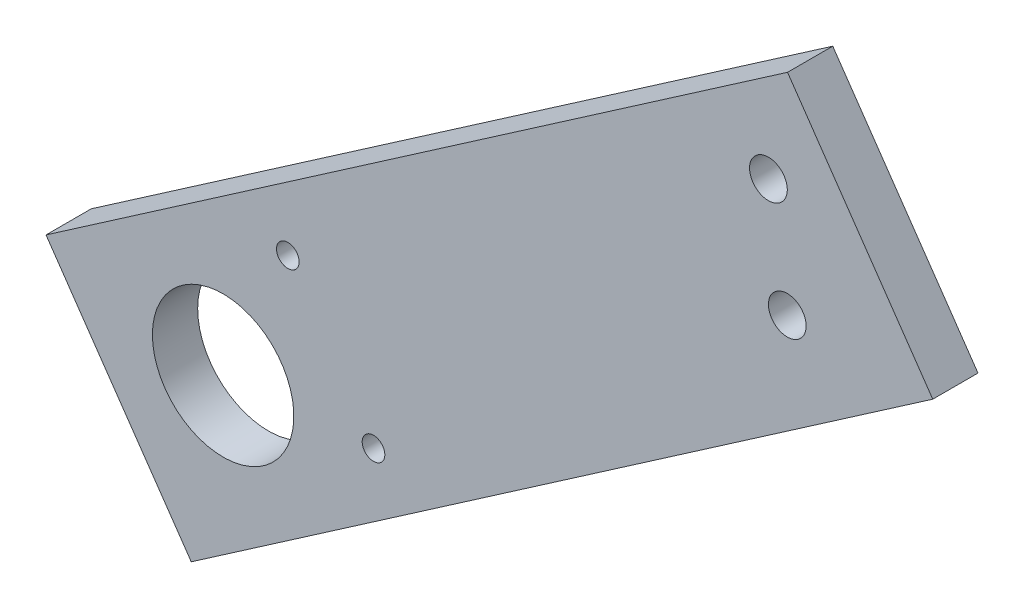
ISO-10303-21;
HEADER;
FILE_DESCRIPTION(('STEP AP214'),'2;1');
FILE_NAME('part.step','',(''),(''),'','','');
FILE_SCHEMA(('AUTOMOTIVE_DESIGN { 1 0 10303 214 1 1 1 1 }'));
ENDSEC;
DATA;
#1=APPLICATION_CONTEXT('core data for automotive mechanical design processes');
#2=APPLICATION_PROTOCOL_DEFINITION('international standard','automotive_design',2000,#1);
#3=PRODUCT_CONTEXT('',#1,'mechanical');
#4=PRODUCT('Part','Part','',(#3));
#5=PRODUCT_RELATED_PRODUCT_CATEGORY('part','',(#4));
#6=PRODUCT_DEFINITION_FORMATION('','',#4);
#7=PRODUCT_DEFINITION_CONTEXT('part definition',#1,'design');
#8=PRODUCT_DEFINITION('design','',#6,#7);
#9=PRODUCT_DEFINITION_SHAPE('','',#8);
#10=(LENGTH_UNIT() NAMED_UNIT(*) SI_UNIT(.MILLI.,.METRE.));
#11=(NAMED_UNIT(*) PLANE_ANGLE_UNIT() SI_UNIT($,.RADIAN.));
#12=(NAMED_UNIT(*) SI_UNIT($,.STERADIAN.) SOLID_ANGLE_UNIT());
#13=UNCERTAINTY_MEASURE_WITH_UNIT(LENGTH_MEASURE(1.E-05),#10,'distance_accuracy_value','');
#14=(GEOMETRIC_REPRESENTATION_CONTEXT(3) GLOBAL_UNCERTAINTY_ASSIGNED_CONTEXT((#13)) GLOBAL_UNIT_ASSIGNED_CONTEXT((#10,
#11,#12)) REPRESENTATION_CONTEXT('',''));
#15=CARTESIAN_POINT('',(0.,0.,0.));
#16=DIRECTION('',(0.,0.,1.));
#17=DIRECTION('',(1.,0.,0.));
#18=AXIS2_PLACEMENT_3D('',#15,#16,#17);
#19=CARTESIAN_POINT('',(503.023620212534,108.421442016098,3.048));
#20=DIRECTION('',(0.,0.,1.));
#21=DIRECTION('',(1.,0.,0.));
#22=AXIS2_PLACEMENT_3D('',#19,#20,#21);
#23=PLANE('',#22);
#24=CARTESIAN_POINT('',(519.308599462827,115.367159157938,3.048));
#25=DIRECTION('',(0.,0.,1.));
#26=DIRECTION('',(1.,0.,0.));
#27=AXIS2_PLACEMENT_3D('',#24,#25,#26);
#28=CIRCLE('',#27,0.762000000000086);
#29=CARTESIAN_POINT('',(518.546599462827,115.367159157938,3.048));
#30=VERTEX_POINT('',#29);
#31=EDGE_CURVE('E124',#30,#30,#28,.T.);
#32=ORIENTED_EDGE('',*,*,#31,.F.);
#33=EDGE_LOOP('',(#32));
#34=FACE_BOUND('',#33,.T.);
#35=CARTESIAN_POINT('',(552.942296833607,128.696327154486,3.048));
#36=DIRECTION('',(0.,0.,1.));
#37=DIRECTION('',(1.,0.,0.));
#38=AXIS2_PLACEMENT_3D('',#35,#36,#37);
#39=CIRCLE('',#38,1.27000000000003);
#40=CARTESIAN_POINT('',(551.672296833607,128.696327154486,3.048));
#41=VERTEX_POINT('',#40);
#42=EDGE_CURVE('E112',#41,#41,#39,.T.);
#43=ORIENTED_EDGE('',*,*,#42,.F.);
#44=EDGE_LOOP('',(#43));
#45=FACE_BOUND('',#44,.T.);
#46=DIRECTION('',(-0.823109940869233,-0.567882052227616,0.));
#47=VECTOR('',#46,1.);
#48=CARTESIAN_POINT('',(552.957131223889,142.871693799126,3.048));
#49=LINE('',#48,#47);
#50=CARTESIAN_POINT('',(552.957131223889,142.871693799126,3.048));
#51=VERTEX_POINT('',#50);
#52=CARTESIAN_POINT('',(503.023620212534,108.421442016098,3.048));
#53=VERTEX_POINT('',#52);
#54=EDGE_CURVE('E82',#51,#53,#49,.T.);
#55=ORIENTED_EDGE('',*,*,#54,.T.);
#56=DIRECTION('',(0.567882052227616,-0.823109940869232,0.));
#57=VECTOR('',#56,1.);
#58=CARTESIAN_POINT('',(503.023620212534,108.421442016098,3.048));
#59=LINE('',#58,#57);
#60=CARTESIAN_POINT('',(512.803524331704,94.2460753714576,3.048));
#61=VERTEX_POINT('',#60);
#62=EDGE_CURVE('E77',#53,#61,#59,.T.);
#63=ORIENTED_EDGE('',*,*,#62,.T.);
#64=DIRECTION('',(0.823109940869232,0.567882052227616,0.));
#65=VECTOR('',#64,1.);
#66=CARTESIAN_POINT('',(562.737035343059,128.696327154486,3.048));
#67=LINE('',#66,#65);
#68=CARTESIAN_POINT('',(562.737035343059,128.696327154486,3.048));
#69=VERTEX_POINT('',#68);
#70=EDGE_CURVE('E80',#61,#69,#67,.T.);
#71=ORIENTED_EDGE('',*,*,#70,.T.);
#72=DIRECTION('',(-0.567882052227616,0.823109940869232,0.));
#73=VECTOR('',#72,1.);
#74=CARTESIAN_POINT('',(552.957131223889,142.871693799126,3.048));
#75=LINE('',#74,#73);
#76=EDGE_CURVE('E47',#69,#51,#75,.T.);
#77=ORIENTED_EDGE('',*,*,#76,.T.);
#78=EDGE_LOOP('',(#55,#63,#71,#77));
#79=FACE_BOUND('',#78,.T.);
#80=CARTESIAN_POINT('',(551.672296833607,136.012198904165,3.048));
#81=DIRECTION('',(0.,0.,1.));
#82=DIRECTION('',(1.,0.,0.));
#83=AXIS2_PLACEMENT_3D('',#80,#81,#82);
#84=CIRCLE('',#83,1.27000000000003);
#85=CARTESIAN_POINT('',(550.402296833607,136.012198904165,3.048));
#86=VERTEX_POINT('',#85);
#87=EDGE_CURVE('E97',#86,#86,#84,.T.);
#88=ORIENTED_EDGE('',*,*,#87,.F.);
#89=EDGE_LOOP('',(#88));
#90=FACE_BOUND('',#89,.T.);
#91=CARTESIAN_POINT('',(514.951045640116,106.189069777125,3.048));
#92=DIRECTION('',(0.,0.,1.));
#93=DIRECTION('',(1.,0.,0.));
#94=AXIS2_PLACEMENT_3D('',#91,#92,#93);
#95=CIRCLE('',#94,4.76250000000001);
#96=CARTESIAN_POINT('',(510.188545640116,106.189069777125,3.048));
#97=VERTEX_POINT('',#96);
#98=EDGE_CURVE('E118',#97,#97,#95,.T.);
#99=ORIENTED_EDGE('',*,*,#98,.F.);
#100=EDGE_LOOP('',(#99));
#101=FACE_BOUND('',#100,.T.);
#102=CARTESIAN_POINT('',(525.078281113459,107.004362158706,3.048));
#103=DIRECTION('',(0.,0.,1.));
#104=DIRECTION('',(1.,0.,0.));
#105=AXIS2_PLACEMENT_3D('',#102,#103,#104);
#106=CIRCLE('',#105,0.761999999999976);
#107=CARTESIAN_POINT('',(524.316281113459,107.004362158706,3.048));
#108=VERTEX_POINT('',#107);
#109=EDGE_CURVE('E130',#108,#108,#106,.T.);
#110=ORIENTED_EDGE('',*,*,#109,.F.);
#111=EDGE_LOOP('',(#110));
#112=FACE_BOUND('',#111,.T.);
#113=ADVANCED_FACE('F30',(#34,#45,#79,#90,#101,#112),#23,.T.);
#114=CARTESIAN_POINT('',(503.023620212534,108.421442016098,0.));
#115=DIRECTION('',(0.,0.,1.));
#116=DIRECTION('',(1.,0.,0.));
#117=AXIS2_PLACEMENT_3D('',#114,#115,#116);
#118=PLANE('',#117);
#119=CARTESIAN_POINT('',(519.308599462827,115.367159157938,0.));
#120=DIRECTION('',(0.,0.,1.));
#121=DIRECTION('',(1.,0.,0.));
#122=AXIS2_PLACEMENT_3D('',#119,#120,#121);
#123=CIRCLE('',#122,0.762000000000086);
#124=CARTESIAN_POINT('',(518.546599462827,115.367159157938,0.));
#125=VERTEX_POINT('',#124);
#126=EDGE_CURVE('E127',#125,#125,#123,.T.);
#127=ORIENTED_EDGE('',*,*,#126,.T.);
#128=EDGE_LOOP('',(#127));
#129=FACE_BOUND('',#128,.T.);
#130=CARTESIAN_POINT('',(552.942296833607,128.696327154486,0.));
#131=DIRECTION('',(0.,0.,1.));
#132=DIRECTION('',(1.,0.,0.));
#133=AXIS2_PLACEMENT_3D('',#130,#131,#132);
#134=CIRCLE('',#133,1.27000000000003);
#135=CARTESIAN_POINT('',(551.672296833607,128.696327154486,0.));
#136=VERTEX_POINT('',#135);
#137=EDGE_CURVE('E115',#136,#136,#134,.T.);
#138=ORIENTED_EDGE('',*,*,#137,.T.);
#139=EDGE_LOOP('',(#138));
#140=FACE_BOUND('',#139,.T.);
#141=DIRECTION('',(-0.823109940869233,-0.567882052227616,0.));
#142=VECTOR('',#141,1.);
#143=CARTESIAN_POINT('',(552.957131223889,142.871693799126,0.));
#144=LINE('',#143,#142);
#145=CARTESIAN_POINT('',(552.957131223889,142.871693799126,0.));
#146=VERTEX_POINT('',#145);
#147=CARTESIAN_POINT('',(503.023620212534,108.421442016098,0.));
#148=VERTEX_POINT('',#147);
#149=EDGE_CURVE('E94',#146,#148,#144,.T.);
#150=ORIENTED_EDGE('',*,*,#149,.F.);
#151=DIRECTION('',(-0.567882052227616,0.823109940869232,0.));
#152=VECTOR('',#151,1.);
#153=CARTESIAN_POINT('',(552.957131223889,142.871693799126,0.));
#154=LINE('',#153,#152);
#155=CARTESIAN_POINT('',(562.737035343059,128.696327154486,0.));
#156=VERTEX_POINT('',#155);
#157=EDGE_CURVE('E70',#156,#146,#154,.T.);
#158=ORIENTED_EDGE('',*,*,#157,.F.);
#159=DIRECTION('',(0.823109940869232,0.567882052227616,0.));
#160=VECTOR('',#159,1.);
#161=CARTESIAN_POINT('',(562.737035343059,128.696327154486,0.));
#162=LINE('',#161,#160);
#163=CARTESIAN_POINT('',(512.803524331704,94.2460753714576,0.));
#164=VERTEX_POINT('',#163);
#165=EDGE_CURVE('E64',#164,#156,#162,.T.);
#166=ORIENTED_EDGE('',*,*,#165,.F.);
#167=DIRECTION('',(0.567882052227616,-0.823109940869232,0.));
#168=VECTOR('',#167,1.);
#169=CARTESIAN_POINT('',(503.023620212534,108.421442016098,0.));
#170=LINE('',#169,#168);
#171=EDGE_CURVE('E86',#148,#164,#170,.T.);
#172=ORIENTED_EDGE('',*,*,#171,.F.);
#173=EDGE_LOOP('',(#150,#158,#166,#172));
#174=FACE_BOUND('',#173,.T.);
#175=CARTESIAN_POINT('',(551.672296833607,136.012198904165,0.));
#176=DIRECTION('',(0.,0.,1.));
#177=DIRECTION('',(1.,0.,0.));
#178=AXIS2_PLACEMENT_3D('',#175,#176,#177);
#179=CIRCLE('',#178,1.27000000000003);
#180=CARTESIAN_POINT('',(550.402296833607,136.012198904165,0.));
#181=VERTEX_POINT('',#180);
#182=EDGE_CURVE('E109',#181,#181,#179,.T.);
#183=ORIENTED_EDGE('',*,*,#182,.T.);
#184=EDGE_LOOP('',(#183));
#185=FACE_BOUND('',#184,.T.);
#186=CARTESIAN_POINT('',(514.951045640116,106.189069777125,0.));
#187=DIRECTION('',(0.,0.,1.));
#188=DIRECTION('',(1.,0.,0.));
#189=AXIS2_PLACEMENT_3D('',#186,#187,#188);
#190=CIRCLE('',#189,4.76250000000001);
#191=CARTESIAN_POINT('',(510.188545640116,106.189069777125,0.));
#192=VERTEX_POINT('',#191);
#193=EDGE_CURVE('E121',#192,#192,#190,.T.);
#194=ORIENTED_EDGE('',*,*,#193,.T.);
#195=EDGE_LOOP('',(#194));
#196=FACE_BOUND('',#195,.T.);
#197=CARTESIAN_POINT('',(525.078281113459,107.004362158706,0.));
#198=DIRECTION('',(0.,0.,1.));
#199=DIRECTION('',(1.,0.,0.));
#200=AXIS2_PLACEMENT_3D('',#197,#198,#199);
#201=CIRCLE('',#200,0.761999999999976);
#202=CARTESIAN_POINT('',(524.316281113459,107.004362158706,0.));
#203=VERTEX_POINT('',#202);
#204=EDGE_CURVE('E133',#203,#203,#201,.T.);
#205=ORIENTED_EDGE('',*,*,#204,.T.);
#206=EDGE_LOOP('',(#205));
#207=FACE_BOUND('',#206,.T.);
#208=ADVANCED_FACE('F105',(#129,#140,#174,#185,#196,#207),#118,.F.);
#209=CARTESIAN_POINT('',(552.957131223889,142.871693799126,3.048));
#210=DIRECTION('',(0.567882052227616,-0.823109940869233,0.));
#211=DIRECTION('',(0.823109940869233,0.567882052227616,0.));
#212=AXIS2_PLACEMENT_3D('',#209,#210,#211);
#213=PLANE('',#212);
#214=ORIENTED_EDGE('',*,*,#149,.T.);
#215=DIRECTION('',(0.,0.,-1.));
#216=VECTOR('',#215,1.);
#217=CARTESIAN_POINT('',(503.023620212534,108.421442016098,3.048));
#218=LINE('',#217,#216);
#219=EDGE_CURVE('E11',#53,#148,#218,.T.);
#220=ORIENTED_EDGE('',*,*,#219,.F.);
#221=ORIENTED_EDGE('',*,*,#54,.F.);
#222=DIRECTION('',(0.,0.,-1.));
#223=VECTOR('',#222,1.);
#224=CARTESIAN_POINT('',(552.957131223889,142.871693799126,3.048));
#225=LINE('',#224,#223);
#226=EDGE_CURVE('E90',#51,#146,#225,.T.);
#227=ORIENTED_EDGE('',*,*,#226,.T.);
#228=EDGE_LOOP('',(#214,#220,#221,#227));
#229=FACE_BOUND('',#228,.T.);
#230=ADVANCED_FACE('F32',(#229),#213,.F.);
#231=CARTESIAN_POINT('',(503.023620212534,108.421442016098,3.048));
#232=DIRECTION('',(0.823109940869233,0.567882052227616,0.));
#233=DIRECTION('',(-0.567882052227616,0.823109940869233,0.));
#234=AXIS2_PLACEMENT_3D('',#231,#232,#233);
#235=PLANE('',#234);
#236=ORIENTED_EDGE('',*,*,#171,.T.);
#237=DIRECTION('',(0.,0.,-1.));
#238=VECTOR('',#237,1.);
#239=CARTESIAN_POINT('',(512.803524331704,94.2460753714576,3.048));
#240=LINE('',#239,#238);
#241=EDGE_CURVE('E39',#61,#164,#240,.T.);
#242=ORIENTED_EDGE('',*,*,#241,.F.);
#243=ORIENTED_EDGE('',*,*,#62,.F.);
#244=ORIENTED_EDGE('',*,*,#219,.T.);
#245=EDGE_LOOP('',(#236,#242,#243,#244));
#246=FACE_BOUND('',#245,.T.);
#247=ADVANCED_FACE('F85',(#246),#235,.F.);
#248=CARTESIAN_POINT('',(562.737035343059,128.696327154486,3.048));
#249=DIRECTION('',(-0.567882052227616,0.823109940869233,0.));
#250=DIRECTION('',(-0.823109940869233,-0.567882052227616,0.));
#251=AXIS2_PLACEMENT_3D('',#248,#249,#250);
#252=PLANE('',#251);
#253=ORIENTED_EDGE('',*,*,#165,.T.);
#254=DIRECTION('',(0.,0.,-1.));
#255=VECTOR('',#254,1.);
#256=CARTESIAN_POINT('',(562.737035343059,128.696327154486,3.048));
#257=LINE('',#256,#255);
#258=EDGE_CURVE('E87',#69,#156,#257,.T.);
#259=ORIENTED_EDGE('',*,*,#258,.F.);
#260=ORIENTED_EDGE('',*,*,#70,.F.);
#261=ORIENTED_EDGE('',*,*,#241,.T.);
#262=EDGE_LOOP('',(#253,#259,#260,#261));
#263=FACE_BOUND('',#262,.T.);
#264=ADVANCED_FACE('F88',(#263),#252,.F.);
#265=CARTESIAN_POINT('',(552.957131223889,142.871693799126,3.048));
#266=DIRECTION('',(-0.823109940869232,-0.567882052227616,0.));
#267=DIRECTION('',(0.567882052227616,-0.823109940869232,0.));
#268=AXIS2_PLACEMENT_3D('',#265,#266,#267);
#269=PLANE('',#268);
#270=ORIENTED_EDGE('',*,*,#157,.T.);
#271=ORIENTED_EDGE('',*,*,#226,.F.);
#272=ORIENTED_EDGE('',*,*,#76,.F.);
#273=ORIENTED_EDGE('',*,*,#258,.T.);
#274=EDGE_LOOP('',(#270,#271,#272,#273));
#275=FACE_BOUND('',#274,.T.);
#276=ADVANCED_FACE('F102',(#275),#269,.F.);
#277=CARTESIAN_POINT('',(551.672296833607,136.012198904165,3.048));
#278=DIRECTION('',(0.,0.,-1.));
#279=DIRECTION('',(-1.,0.,0.));
#280=AXIS2_PLACEMENT_3D('',#277,#278,#279);
#281=CYLINDRICAL_SURFACE('',#280,1.27000000000003);
#282=CARTESIAN_POINT('',(550.402296833607,136.012198904165,3.048));
#283=CARTESIAN_POINT('',(550.402296833607,136.012198904165,3.01625));
#284=CARTESIAN_POINT('',(550.402296833607,136.012198904165,2.9845));
#285=CARTESIAN_POINT('',(550.402296833607,136.012198904165,2.921));
#286=CARTESIAN_POINT('',(550.402296833607,136.012198904165,2.88925));
#287=CARTESIAN_POINT('',(550.402296833607,136.012198904165,2.82575));
#288=CARTESIAN_POINT('',(550.402296833607,136.012198904165,2.794));
#289=CARTESIAN_POINT('',(550.402296833607,136.012198904165,2.7305));
#290=CARTESIAN_POINT('',(550.402296833607,136.012198904165,2.69875));
#291=CARTESIAN_POINT('',(550.402296833607,136.012198904165,2.63525));
#292=CARTESIAN_POINT('',(550.402296833607,136.012198904165,2.6035));
#293=CARTESIAN_POINT('',(550.402296833607,136.012198904165,2.54));
#294=CARTESIAN_POINT('',(550.402296833607,136.012198904165,2.50825));
#295=CARTESIAN_POINT('',(550.402296833607,136.012198904165,2.44475));
#296=CARTESIAN_POINT('',(550.402296833607,136.012198904165,2.413));
#297=CARTESIAN_POINT('',(550.402296833607,136.012198904165,2.3495));
#298=CARTESIAN_POINT('',(550.402296833607,136.012198904165,2.31775));
#299=CARTESIAN_POINT('',(550.402296833607,136.012198904165,2.25425));
#300=CARTESIAN_POINT('',(550.402296833607,136.012198904165,2.2225));
#301=CARTESIAN_POINT('',(550.402296833607,136.012198904165,2.159));
#302=CARTESIAN_POINT('',(550.402296833607,136.012198904165,2.12725));
#303=CARTESIAN_POINT('',(550.402296833607,136.012198904165,2.06375));
#304=CARTESIAN_POINT('',(550.402296833607,136.012198904165,2.032));
#305=CARTESIAN_POINT('',(550.402296833607,136.012198904165,1.9685));
#306=CARTESIAN_POINT('',(550.402296833607,136.012198904165,1.93675));
#307=CARTESIAN_POINT('',(550.402296833607,136.012198904165,1.87325));
#308=CARTESIAN_POINT('',(550.402296833607,136.012198904165,1.8415));
#309=CARTESIAN_POINT('',(550.402296833607,136.012198904165,1.778));
#310=CARTESIAN_POINT('',(550.402296833607,136.012198904165,1.74625));
#311=CARTESIAN_POINT('',(550.402296833607,136.012198904165,1.68275));
#312=CARTESIAN_POINT('',(550.402296833607,136.012198904165,1.651));
#313=CARTESIAN_POINT('',(550.402296833607,136.012198904165,1.5875));
#314=CARTESIAN_POINT('',(550.402296833607,136.012198904165,1.55575));
#315=CARTESIAN_POINT('',(550.402296833607,136.012198904165,1.49225));
#316=CARTESIAN_POINT('',(550.402296833607,136.012198904165,1.4605));
#317=CARTESIAN_POINT('',(550.402296833607,136.012198904165,1.397));
#318=CARTESIAN_POINT('',(550.402296833607,136.012198904165,1.36525));
#319=CARTESIAN_POINT('',(550.402296833607,136.012198904165,1.30175));
#320=CARTESIAN_POINT('',(550.402296833607,136.012198904165,1.27));
#321=CARTESIAN_POINT('',(550.402296833607,136.012198904165,1.2065));
#322=CARTESIAN_POINT('',(550.402296833607,136.012198904165,1.17475));
#323=CARTESIAN_POINT('',(550.402296833607,136.012198904165,1.11125));
#324=CARTESIAN_POINT('',(550.402296833607,136.012198904165,1.0795));
#325=CARTESIAN_POINT('',(550.402296833607,136.012198904165,1.016));
#326=CARTESIAN_POINT('',(550.402296833607,136.012198904165,0.98425));
#327=CARTESIAN_POINT('',(550.402296833607,136.012198904165,0.92075));
#328=CARTESIAN_POINT('',(550.402296833607,136.012198904165,0.889));
#329=CARTESIAN_POINT('',(550.402296833607,136.012198904165,0.8255));
#330=CARTESIAN_POINT('',(550.402296833607,136.012198904165,0.79375));
#331=CARTESIAN_POINT('',(550.402296833607,136.012198904165,0.73025));
#332=CARTESIAN_POINT('',(550.402296833607,136.012198904165,0.6985));
#333=CARTESIAN_POINT('',(550.402296833607,136.012198904165,0.635));
#334=CARTESIAN_POINT('',(550.402296833607,136.012198904165,0.60325));
#335=CARTESIAN_POINT('',(550.402296833607,136.012198904165,0.53975));
#336=CARTESIAN_POINT('',(550.402296833607,136.012198904165,0.508));
#337=CARTESIAN_POINT('',(550.402296833607,136.012198904165,0.4445));
#338=CARTESIAN_POINT('',(550.402296833607,136.012198904165,0.41275));
#339=CARTESIAN_POINT('',(550.402296833607,136.012198904165,0.34925));
#340=CARTESIAN_POINT('',(550.402296833607,136.012198904165,0.3175));
#341=CARTESIAN_POINT('',(550.402296833607,136.012198904165,0.254));
#342=CARTESIAN_POINT('',(550.402296833607,136.012198904165,0.22225));
#343=CARTESIAN_POINT('',(550.402296833607,136.012198904165,0.15875));
#344=CARTESIAN_POINT('',(550.402296833607,136.012198904165,0.127));
#345=CARTESIAN_POINT('',(550.402296833607,136.012198904165,0.0634999999999999));
#346=CARTESIAN_POINT('',(550.402296833607,136.012198904165,0.03175));
#347=CARTESIAN_POINT('',(550.402296833607,136.012198904165,0.));
#348=B_SPLINE_CURVE_WITH_KNOTS('',3,(#282,#283,#284,#285,#286,#287,#288,#289,#290,#291,#292,
#293,#294,#295,#296,#297,#298,#299,#300,#301,#302,#303,#304,#305,#306,#307,#308,#309,#310,#311,
#312,#313,#314,#315,#316,#317,#318,#319,#320,#321,#322,#323,#324,#325,#326,#327,#328,#329,#330,
#331,#332,#333,#334,#335,#336,#337,#338,#339,#340,#341,#342,#343,#344,#345,#346,#347),
.UNSPECIFIED.,.F.,.F.,(4,2,2,2,2,2,2,2,2,2,2,2,2,2,2,2,2,2,2,2,2,2,2,2,2,2,2,2,2,2,2,2,4),(0.,
0.0952499999999998,0.1905,0.28575,0.381,0.47625,0.5715,0.66675,0.762,0.85725,0.9525,1.04775,
1.143,1.23825,1.3335,1.42875,1.524,1.61925,1.7145,1.80975,1.905,2.00025,2.0955,2.19075,2.286,
2.38125,2.4765,2.57175,2.667,2.76225,2.8575,2.95275,3.048),.UNSPECIFIED.);
#349=EDGE_CURVE('BSEAM153',#86,#181,#348,.T.);
#350=ORIENTED_EDGE('',*,*,#87,.T.);
#351=ORIENTED_EDGE('',*,*,#182,.F.);
#352=ORIENTED_EDGE('',*,*,#349,.T.);
#353=ORIENTED_EDGE('',*,*,#349,.F.);
#354=EDGE_LOOP('',(#350,#352,#351,#353));
#355=FACE_BOUND('',#354,.T.);
#356=ADVANCED_FACE('F153',(#355),#281,.F.);
#357=CARTESIAN_POINT('',(552.942296833607,128.696327154486,3.048));
#358=DIRECTION('',(0.,0.,-1.));
#359=DIRECTION('',(-1.,0.,0.));
#360=AXIS2_PLACEMENT_3D('',#357,#358,#359);
#361=CYLINDRICAL_SURFACE('',#360,1.27000000000003);
#362=CARTESIAN_POINT('',(551.672296833607,128.696327154486,3.048));
#363=CARTESIAN_POINT('',(551.672296833607,128.696327154486,3.01625));
#364=CARTESIAN_POINT('',(551.672296833607,128.696327154486,2.9845));
#365=CARTESIAN_POINT('',(551.672296833607,128.696327154486,2.921));
#366=CARTESIAN_POINT('',(551.672296833607,128.696327154486,2.88925));
#367=CARTESIAN_POINT('',(551.672296833607,128.696327154486,2.82575));
#368=CARTESIAN_POINT('',(551.672296833607,128.696327154486,2.794));
#369=CARTESIAN_POINT('',(551.672296833607,128.696327154486,2.7305));
#370=CARTESIAN_POINT('',(551.672296833607,128.696327154486,2.69875));
#371=CARTESIAN_POINT('',(551.672296833607,128.696327154486,2.63525));
#372=CARTESIAN_POINT('',(551.672296833607,128.696327154486,2.6035));
#373=CARTESIAN_POINT('',(551.672296833607,128.696327154486,2.54));
#374=CARTESIAN_POINT('',(551.672296833607,128.696327154486,2.50825));
#375=CARTESIAN_POINT('',(551.672296833607,128.696327154486,2.44475));
#376=CARTESIAN_POINT('',(551.672296833607,128.696327154486,2.413));
#377=CARTESIAN_POINT('',(551.672296833607,128.696327154486,2.3495));
#378=CARTESIAN_POINT('',(551.672296833607,128.696327154486,2.31775));
#379=CARTESIAN_POINT('',(551.672296833607,128.696327154486,2.25425));
#380=CARTESIAN_POINT('',(551.672296833607,128.696327154486,2.2225));
#381=CARTESIAN_POINT('',(551.672296833607,128.696327154486,2.159));
#382=CARTESIAN_POINT('',(551.672296833607,128.696327154486,2.12725));
#383=CARTESIAN_POINT('',(551.672296833607,128.696327154486,2.06375));
#384=CARTESIAN_POINT('',(551.672296833607,128.696327154486,2.032));
#385=CARTESIAN_POINT('',(551.672296833607,128.696327154486,1.9685));
#386=CARTESIAN_POINT('',(551.672296833607,128.696327154486,1.93675));
#387=CARTESIAN_POINT('',(551.672296833607,128.696327154486,1.87325));
#388=CARTESIAN_POINT('',(551.672296833607,128.696327154486,1.8415));
#389=CARTESIAN_POINT('',(551.672296833607,128.696327154486,1.778));
#390=CARTESIAN_POINT('',(551.672296833607,128.696327154486,1.74625));
#391=CARTESIAN_POINT('',(551.672296833607,128.696327154486,1.68275));
#392=CARTESIAN_POINT('',(551.672296833607,128.696327154486,1.651));
#393=CARTESIAN_POINT('',(551.672296833607,128.696327154486,1.5875));
#394=CARTESIAN_POINT('',(551.672296833607,128.696327154486,1.55575));
#395=CARTESIAN_POINT('',(551.672296833607,128.696327154486,1.49225));
#396=CARTESIAN_POINT('',(551.672296833607,128.696327154486,1.4605));
#397=CARTESIAN_POINT('',(551.672296833607,128.696327154486,1.397));
#398=CARTESIAN_POINT('',(551.672296833607,128.696327154486,1.36525));
#399=CARTESIAN_POINT('',(551.672296833607,128.696327154486,1.30175));
#400=CARTESIAN_POINT('',(551.672296833607,128.696327154486,1.27));
#401=CARTESIAN_POINT('',(551.672296833607,128.696327154486,1.2065));
#402=CARTESIAN_POINT('',(551.672296833607,128.696327154486,1.17475));
#403=CARTESIAN_POINT('',(551.672296833607,128.696327154486,1.11125));
#404=CARTESIAN_POINT('',(551.672296833607,128.696327154486,1.0795));
#405=CARTESIAN_POINT('',(551.672296833607,128.696327154486,1.016));
#406=CARTESIAN_POINT('',(551.672296833607,128.696327154486,0.98425));
#407=CARTESIAN_POINT('',(551.672296833607,128.696327154486,0.92075));
#408=CARTESIAN_POINT('',(551.672296833607,128.696327154486,0.889));
#409=CARTESIAN_POINT('',(551.672296833607,128.696327154486,0.8255));
#410=CARTESIAN_POINT('',(551.672296833607,128.696327154486,0.79375));
#411=CARTESIAN_POINT('',(551.672296833607,128.696327154486,0.73025));
#412=CARTESIAN_POINT('',(551.672296833607,128.696327154486,0.6985));
#413=CARTESIAN_POINT('',(551.672296833607,128.696327154486,0.635));
#414=CARTESIAN_POINT('',(551.672296833607,128.696327154486,0.60325));
#415=CARTESIAN_POINT('',(551.672296833607,128.696327154486,0.53975));
#416=CARTESIAN_POINT('',(551.672296833607,128.696327154486,0.508));
#417=CARTESIAN_POINT('',(551.672296833607,128.696327154486,0.4445));
#418=CARTESIAN_POINT('',(551.672296833607,128.696327154486,0.41275));
#419=CARTESIAN_POINT('',(551.672296833607,128.696327154486,0.34925));
#420=CARTESIAN_POINT('',(551.672296833607,128.696327154486,0.3175));
#421=CARTESIAN_POINT('',(551.672296833607,128.696327154486,0.254));
#422=CARTESIAN_POINT('',(551.672296833607,128.696327154486,0.22225));
#423=CARTESIAN_POINT('',(551.672296833607,128.696327154486,0.15875));
#424=CARTESIAN_POINT('',(551.672296833607,128.696327154486,0.127));
#425=CARTESIAN_POINT('',(551.672296833607,128.696327154486,0.0634999999999999));
#426=CARTESIAN_POINT('',(551.672296833607,128.696327154486,0.03175));
#427=CARTESIAN_POINT('',(551.672296833607,128.696327154486,0.));
#428=B_SPLINE_CURVE_WITH_KNOTS('',3,(#362,#363,#364,#365,#366,#367,#368,#369,#370,#371,#372,
#373,#374,#375,#376,#377,#378,#379,#380,#381,#382,#383,#384,#385,#386,#387,#388,#389,#390,#391,
#392,#393,#394,#395,#396,#397,#398,#399,#400,#401,#402,#403,#404,#405,#406,#407,#408,#409,#410,
#411,#412,#413,#414,#415,#416,#417,#418,#419,#420,#421,#422,#423,#424,#425,#426,#427),
.UNSPECIFIED.,.F.,.F.,(4,2,2,2,2,2,2,2,2,2,2,2,2,2,2,2,2,2,2,2,2,2,2,2,2,2,2,2,2,2,2,2,4),(0.,
0.0952499999999998,0.1905,0.28575,0.381,0.47625,0.5715,0.66675,0.762,0.85725,0.9525,1.04775,
1.143,1.23825,1.3335,1.42875,1.524,1.61925,1.7145,1.80975,1.905,2.00025,2.0955,2.19075,2.286,
2.38125,2.4765,2.57175,2.667,2.76225,2.8575,2.95275,3.048),.UNSPECIFIED.);
#429=EDGE_CURVE('BSEAM199',#41,#136,#428,.T.);
#430=ORIENTED_EDGE('',*,*,#42,.T.);
#431=ORIENTED_EDGE('',*,*,#137,.F.);
#432=ORIENTED_EDGE('',*,*,#429,.T.);
#433=ORIENTED_EDGE('',*,*,#429,.F.);
#434=EDGE_LOOP('',(#430,#432,#431,#433));
#435=FACE_BOUND('',#434,.T.);
#436=ADVANCED_FACE('F199',(#435),#361,.F.);
#437=CARTESIAN_POINT('',(514.951045640116,106.189069777125,3.048));
#438=DIRECTION('',(0.,0.,-1.));
#439=DIRECTION('',(-1.,0.,0.));
#440=AXIS2_PLACEMENT_3D('',#437,#438,#439);
#441=CYLINDRICAL_SURFACE('',#440,4.76250000000001);
#442=CARTESIAN_POINT('',(510.188545640116,106.189069777125,3.048));
#443=CARTESIAN_POINT('',(510.188545640116,106.189069777125,3.01625));
#444=CARTESIAN_POINT('',(510.188545640116,106.189069777125,2.9845));
#445=CARTESIAN_POINT('',(510.188545640116,106.189069777125,2.921));
#446=CARTESIAN_POINT('',(510.188545640116,106.189069777125,2.88925));
#447=CARTESIAN_POINT('',(510.188545640116,106.189069777125,2.82575));
#448=CARTESIAN_POINT('',(510.188545640116,106.189069777125,2.794));
#449=CARTESIAN_POINT('',(510.188545640116,106.189069777125,2.7305));
#450=CARTESIAN_POINT('',(510.188545640116,106.189069777125,2.69875));
#451=CARTESIAN_POINT('',(510.188545640116,106.189069777125,2.63525));
#452=CARTESIAN_POINT('',(510.188545640116,106.189069777125,2.6035));
#453=CARTESIAN_POINT('',(510.188545640116,106.189069777125,2.54));
#454=CARTESIAN_POINT('',(510.188545640116,106.189069777125,2.50825));
#455=CARTESIAN_POINT('',(510.188545640116,106.189069777125,2.44475));
#456=CARTESIAN_POINT('',(510.188545640116,106.189069777125,2.413));
#457=CARTESIAN_POINT('',(510.188545640116,106.189069777125,2.3495));
#458=CARTESIAN_POINT('',(510.188545640116,106.189069777125,2.31775));
#459=CARTESIAN_POINT('',(510.188545640116,106.189069777125,2.25425));
#460=CARTESIAN_POINT('',(510.188545640116,106.189069777125,2.2225));
#461=CARTESIAN_POINT('',(510.188545640116,106.189069777125,2.159));
#462=CARTESIAN_POINT('',(510.188545640116,106.189069777125,2.12725));
#463=CARTESIAN_POINT('',(510.188545640116,106.189069777125,2.06375));
#464=CARTESIAN_POINT('',(510.188545640116,106.189069777125,2.032));
#465=CARTESIAN_POINT('',(510.188545640116,106.189069777125,1.9685));
#466=CARTESIAN_POINT('',(510.188545640116,106.189069777125,1.93675));
#467=CARTESIAN_POINT('',(510.188545640116,106.189069777125,1.87325));
#468=CARTESIAN_POINT('',(510.188545640116,106.189069777125,1.8415));
#469=CARTESIAN_POINT('',(510.188545640116,106.189069777125,1.778));
#470=CARTESIAN_POINT('',(510.188545640116,106.189069777125,1.74625));
#471=CARTESIAN_POINT('',(510.188545640116,106.189069777125,1.68275));
#472=CARTESIAN_POINT('',(510.188545640116,106.189069777125,1.651));
#473=CARTESIAN_POINT('',(510.188545640116,106.189069777125,1.5875));
#474=CARTESIAN_POINT('',(510.188545640116,106.189069777125,1.55575));
#475=CARTESIAN_POINT('',(510.188545640116,106.189069777125,1.49225));
#476=CARTESIAN_POINT('',(510.188545640116,106.189069777125,1.4605));
#477=CARTESIAN_POINT('',(510.188545640116,106.189069777125,1.397));
#478=CARTESIAN_POINT('',(510.188545640116,106.189069777125,1.36525));
#479=CARTESIAN_POINT('',(510.188545640116,106.189069777125,1.30175));
#480=CARTESIAN_POINT('',(510.188545640116,106.189069777125,1.27));
#481=CARTESIAN_POINT('',(510.188545640116,106.189069777125,1.2065));
#482=CARTESIAN_POINT('',(510.188545640116,106.189069777125,1.17475));
#483=CARTESIAN_POINT('',(510.188545640116,106.189069777125,1.11125));
#484=CARTESIAN_POINT('',(510.188545640116,106.189069777125,1.0795));
#485=CARTESIAN_POINT('',(510.188545640116,106.189069777125,1.016));
#486=CARTESIAN_POINT('',(510.188545640116,106.189069777125,0.98425));
#487=CARTESIAN_POINT('',(510.188545640116,106.189069777125,0.92075));
#488=CARTESIAN_POINT('',(510.188545640116,106.189069777125,0.889));
#489=CARTESIAN_POINT('',(510.188545640116,106.189069777125,0.8255));
#490=CARTESIAN_POINT('',(510.188545640116,106.189069777125,0.79375));
#491=CARTESIAN_POINT('',(510.188545640116,106.189069777125,0.73025));
#492=CARTESIAN_POINT('',(510.188545640116,106.189069777125,0.6985));
#493=CARTESIAN_POINT('',(510.188545640116,106.189069777125,0.635));
#494=CARTESIAN_POINT('',(510.188545640116,106.189069777125,0.60325));
#495=CARTESIAN_POINT('',(510.188545640116,106.189069777125,0.53975));
#496=CARTESIAN_POINT('',(510.188545640116,106.189069777125,0.508));
#497=CARTESIAN_POINT('',(510.188545640116,106.189069777125,0.4445));
#498=CARTESIAN_POINT('',(510.188545640116,106.189069777125,0.41275));
#499=CARTESIAN_POINT('',(510.188545640116,106.189069777125,0.34925));
#500=CARTESIAN_POINT('',(510.188545640116,106.189069777125,0.3175));
#501=CARTESIAN_POINT('',(510.188545640116,106.189069777125,0.254));
#502=CARTESIAN_POINT('',(510.188545640116,106.189069777125,0.22225));
#503=CARTESIAN_POINT('',(510.188545640116,106.189069777125,0.15875));
#504=CARTESIAN_POINT('',(510.188545640116,106.189069777125,0.127));
#505=CARTESIAN_POINT('',(510.188545640116,106.189069777125,0.0634999999999999));
#506=CARTESIAN_POINT('',(510.188545640116,106.189069777125,0.03175));
#507=CARTESIAN_POINT('',(510.188545640116,106.189069777125,0.));
#508=B_SPLINE_CURVE_WITH_KNOTS('',3,(#442,#443,#444,#445,#446,#447,#448,#449,#450,#451,#452,
#453,#454,#455,#456,#457,#458,#459,#460,#461,#462,#463,#464,#465,#466,#467,#468,#469,#470,#471,
#472,#473,#474,#475,#476,#477,#478,#479,#480,#481,#482,#483,#484,#485,#486,#487,#488,#489,#490,
#491,#492,#493,#494,#495,#496,#497,#498,#499,#500,#501,#502,#503,#504,#505,#506,#507),
.UNSPECIFIED.,.F.,.F.,(4,2,2,2,2,2,2,2,2,2,2,2,2,2,2,2,2,2,2,2,2,2,2,2,2,2,2,2,2,2,2,2,4),(0.,
0.0952499999999998,0.1905,0.28575,0.381,0.47625,0.5715,0.66675,0.762,0.85725,0.9525,1.04775,
1.143,1.23825,1.3335,1.42875,1.524,1.61925,1.7145,1.80975,1.905,2.00025,2.0955,2.19075,2.286,
2.38125,2.4765,2.57175,2.667,2.76225,2.8575,2.95275,3.048),.UNSPECIFIED.);
#509=EDGE_CURVE('BSEAM207',#97,#192,#508,.T.);
#510=ORIENTED_EDGE('',*,*,#98,.T.);
#511=ORIENTED_EDGE('',*,*,#193,.F.);
#512=ORIENTED_EDGE('',*,*,#509,.T.);
#513=ORIENTED_EDGE('',*,*,#509,.F.);
#514=EDGE_LOOP('',(#510,#512,#511,#513));
#515=FACE_BOUND('',#514,.T.);
#516=ADVANCED_FACE('F207',(#515),#441,.F.);
#517=CARTESIAN_POINT('',(519.308599462827,115.367159157938,3.048));
#518=DIRECTION('',(0.,0.,-1.));
#519=DIRECTION('',(-1.,0.,0.));
#520=AXIS2_PLACEMENT_3D('',#517,#518,#519);
#521=CYLINDRICAL_SURFACE('',#520,0.762000000000086);
#522=CARTESIAN_POINT('',(518.546599462827,115.367159157938,3.048));
#523=CARTESIAN_POINT('',(518.546599462827,115.367159157938,3.01625));
#524=CARTESIAN_POINT('',(518.546599462827,115.367159157938,2.9845));
#525=CARTESIAN_POINT('',(518.546599462827,115.367159157938,2.921));
#526=CARTESIAN_POINT('',(518.546599462827,115.367159157938,2.88925));
#527=CARTESIAN_POINT('',(518.546599462827,115.367159157938,2.82575));
#528=CARTESIAN_POINT('',(518.546599462827,115.367159157938,2.794));
#529=CARTESIAN_POINT('',(518.546599462827,115.367159157938,2.7305));
#530=CARTESIAN_POINT('',(518.546599462827,115.367159157938,2.69875));
#531=CARTESIAN_POINT('',(518.546599462827,115.367159157938,2.63525));
#532=CARTESIAN_POINT('',(518.546599462827,115.367159157938,2.6035));
#533=CARTESIAN_POINT('',(518.546599462827,115.367159157938,2.54));
#534=CARTESIAN_POINT('',(518.546599462827,115.367159157938,2.50825));
#535=CARTESIAN_POINT('',(518.546599462827,115.367159157938,2.44475));
#536=CARTESIAN_POINT('',(518.546599462827,115.367159157938,2.413));
#537=CARTESIAN_POINT('',(518.546599462827,115.367159157938,2.3495));
#538=CARTESIAN_POINT('',(518.546599462827,115.367159157938,2.31775));
#539=CARTESIAN_POINT('',(518.546599462827,115.367159157938,2.25425));
#540=CARTESIAN_POINT('',(518.546599462827,115.367159157938,2.2225));
#541=CARTESIAN_POINT('',(518.546599462827,115.367159157938,2.159));
#542=CARTESIAN_POINT('',(518.546599462827,115.367159157938,2.12725));
#543=CARTESIAN_POINT('',(518.546599462827,115.367159157938,2.06375));
#544=CARTESIAN_POINT('',(518.546599462827,115.367159157938,2.032));
#545=CARTESIAN_POINT('',(518.546599462827,115.367159157938,1.9685));
#546=CARTESIAN_POINT('',(518.546599462827,115.367159157938,1.93675));
#547=CARTESIAN_POINT('',(518.546599462827,115.367159157938,1.87325));
#548=CARTESIAN_POINT('',(518.546599462827,115.367159157938,1.8415));
#549=CARTESIAN_POINT('',(518.546599462827,115.367159157938,1.778));
#550=CARTESIAN_POINT('',(518.546599462827,115.367159157938,1.74625));
#551=CARTESIAN_POINT('',(518.546599462827,115.367159157938,1.68275));
#552=CARTESIAN_POINT('',(518.546599462827,115.367159157938,1.651));
#553=CARTESIAN_POINT('',(518.546599462827,115.367159157938,1.5875));
#554=CARTESIAN_POINT('',(518.546599462827,115.367159157938,1.55575));
#555=CARTESIAN_POINT('',(518.546599462827,115.367159157938,1.49225));
#556=CARTESIAN_POINT('',(518.546599462827,115.367159157938,1.4605));
#557=CARTESIAN_POINT('',(518.546599462827,115.367159157938,1.397));
#558=CARTESIAN_POINT('',(518.546599462827,115.367159157938,1.36525));
#559=CARTESIAN_POINT('',(518.546599462827,115.367159157938,1.30175));
#560=CARTESIAN_POINT('',(518.546599462827,115.367159157938,1.27));
#561=CARTESIAN_POINT('',(518.546599462827,115.367159157938,1.2065));
#562=CARTESIAN_POINT('',(518.546599462827,115.367159157938,1.17475));
#563=CARTESIAN_POINT('',(518.546599462827,115.367159157938,1.11125));
#564=CARTESIAN_POINT('',(518.546599462827,115.367159157938,1.0795));
#565=CARTESIAN_POINT('',(518.546599462827,115.367159157938,1.016));
#566=CARTESIAN_POINT('',(518.546599462827,115.367159157938,0.98425));
#567=CARTESIAN_POINT('',(518.546599462827,115.367159157938,0.92075));
#568=CARTESIAN_POINT('',(518.546599462827,115.367159157938,0.889));
#569=CARTESIAN_POINT('',(518.546599462827,115.367159157938,0.8255));
#570=CARTESIAN_POINT('',(518.546599462827,115.367159157938,0.79375));
#571=CARTESIAN_POINT('',(518.546599462827,115.367159157938,0.73025));
#572=CARTESIAN_POINT('',(518.546599462827,115.367159157938,0.6985));
#573=CARTESIAN_POINT('',(518.546599462827,115.367159157938,0.635));
#574=CARTESIAN_POINT('',(518.546599462827,115.367159157938,0.60325));
#575=CARTESIAN_POINT('',(518.546599462827,115.367159157938,0.53975));
#576=CARTESIAN_POINT('',(518.546599462827,115.367159157938,0.508));
#577=CARTESIAN_POINT('',(518.546599462827,115.367159157938,0.4445));
#578=CARTESIAN_POINT('',(518.546599462827,115.367159157938,0.41275));
#579=CARTESIAN_POINT('',(518.546599462827,115.367159157938,0.34925));
#580=CARTESIAN_POINT('',(518.546599462827,115.367159157938,0.3175));
#581=CARTESIAN_POINT('',(518.546599462827,115.367159157938,0.254));
#582=CARTESIAN_POINT('',(518.546599462827,115.367159157938,0.22225));
#583=CARTESIAN_POINT('',(518.546599462827,115.367159157938,0.15875));
#584=CARTESIAN_POINT('',(518.546599462827,115.367159157938,0.127));
#585=CARTESIAN_POINT('',(518.546599462827,115.367159157938,0.0634999999999999));
#586=CARTESIAN_POINT('',(518.546599462827,115.367159157938,0.03175));
#587=CARTESIAN_POINT('',(518.546599462827,115.367159157938,0.));
#588=B_SPLINE_CURVE_WITH_KNOTS('',3,(#522,#523,#524,#525,#526,#527,#528,#529,#530,#531,#532,
#533,#534,#535,#536,#537,#538,#539,#540,#541,#542,#543,#544,#545,#546,#547,#548,#549,#550,#551,
#552,#553,#554,#555,#556,#557,#558,#559,#560,#561,#562,#563,#564,#565,#566,#567,#568,#569,#570,
#571,#572,#573,#574,#575,#576,#577,#578,#579,#580,#581,#582,#583,#584,#585,#586,#587),
.UNSPECIFIED.,.F.,.F.,(4,2,2,2,2,2,2,2,2,2,2,2,2,2,2,2,2,2,2,2,2,2,2,2,2,2,2,2,2,2,2,2,4),(0.,
0.0952499999999998,0.1905,0.28575,0.381,0.47625,0.5715,0.66675,0.762,0.85725,0.9525,1.04775,
1.143,1.23825,1.3335,1.42875,1.524,1.61925,1.7145,1.80975,1.905,2.00025,2.0955,2.19075,2.286,
2.38125,2.4765,2.57175,2.667,2.76225,2.8575,2.95275,3.048),.UNSPECIFIED.);
#589=EDGE_CURVE('BSEAM215',#30,#125,#588,.T.);
#590=ORIENTED_EDGE('',*,*,#31,.T.);
#591=ORIENTED_EDGE('',*,*,#126,.F.);
#592=ORIENTED_EDGE('',*,*,#589,.T.);
#593=ORIENTED_EDGE('',*,*,#589,.F.);
#594=EDGE_LOOP('',(#590,#592,#591,#593));
#595=FACE_BOUND('',#594,.T.);
#596=ADVANCED_FACE('F215',(#595),#521,.F.);
#597=CARTESIAN_POINT('',(525.078281113459,107.004362158706,3.048));
#598=DIRECTION('',(0.,0.,-1.));
#599=DIRECTION('',(-1.,0.,0.));
#600=AXIS2_PLACEMENT_3D('',#597,#598,#599);
#601=CYLINDRICAL_SURFACE('',#600,0.761999999999976);
#602=CARTESIAN_POINT('',(524.316281113459,107.004362158706,3.048));
#603=CARTESIAN_POINT('',(524.316281113459,107.004362158706,3.01625));
#604=CARTESIAN_POINT('',(524.316281113459,107.004362158706,2.9845));
#605=CARTESIAN_POINT('',(524.316281113459,107.004362158706,2.921));
#606=CARTESIAN_POINT('',(524.316281113459,107.004362158706,2.88925));
#607=CARTESIAN_POINT('',(524.316281113459,107.004362158706,2.82575));
#608=CARTESIAN_POINT('',(524.316281113459,107.004362158706,2.794));
#609=CARTESIAN_POINT('',(524.316281113459,107.004362158706,2.7305));
#610=CARTESIAN_POINT('',(524.316281113459,107.004362158706,2.69875));
#611=CARTESIAN_POINT('',(524.316281113459,107.004362158706,2.63525));
#612=CARTESIAN_POINT('',(524.316281113459,107.004362158706,2.6035));
#613=CARTESIAN_POINT('',(524.316281113459,107.004362158706,2.54));
#614=CARTESIAN_POINT('',(524.316281113459,107.004362158706,2.50825));
#615=CARTESIAN_POINT('',(524.316281113459,107.004362158706,2.44475));
#616=CARTESIAN_POINT('',(524.316281113459,107.004362158706,2.413));
#617=CARTESIAN_POINT('',(524.316281113459,107.004362158706,2.3495));
#618=CARTESIAN_POINT('',(524.316281113459,107.004362158706,2.31775));
#619=CARTESIAN_POINT('',(524.316281113459,107.004362158706,2.25425));
#620=CARTESIAN_POINT('',(524.316281113459,107.004362158706,2.2225));
#621=CARTESIAN_POINT('',(524.316281113459,107.004362158706,2.159));
#622=CARTESIAN_POINT('',(524.316281113459,107.004362158706,2.12725));
#623=CARTESIAN_POINT('',(524.316281113459,107.004362158706,2.06375));
#624=CARTESIAN_POINT('',(524.316281113459,107.004362158706,2.032));
#625=CARTESIAN_POINT('',(524.316281113459,107.004362158706,1.9685));
#626=CARTESIAN_POINT('',(524.316281113459,107.004362158706,1.93675));
#627=CARTESIAN_POINT('',(524.316281113459,107.004362158706,1.87325));
#628=CARTESIAN_POINT('',(524.316281113459,107.004362158706,1.8415));
#629=CARTESIAN_POINT('',(524.316281113459,107.004362158706,1.778));
#630=CARTESIAN_POINT('',(524.316281113459,107.004362158706,1.74625));
#631=CARTESIAN_POINT('',(524.316281113459,107.004362158706,1.68275));
#632=CARTESIAN_POINT('',(524.316281113459,107.004362158706,1.651));
#633=CARTESIAN_POINT('',(524.316281113459,107.004362158706,1.5875));
#634=CARTESIAN_POINT('',(524.316281113459,107.004362158706,1.55575));
#635=CARTESIAN_POINT('',(524.316281113459,107.004362158706,1.49225));
#636=CARTESIAN_POINT('',(524.316281113459,107.004362158706,1.4605));
#637=CARTESIAN_POINT('',(524.316281113459,107.004362158706,1.397));
#638=CARTESIAN_POINT('',(524.316281113459,107.004362158706,1.36525));
#639=CARTESIAN_POINT('',(524.316281113459,107.004362158706,1.30175));
#640=CARTESIAN_POINT('',(524.316281113459,107.004362158706,1.27));
#641=CARTESIAN_POINT('',(524.316281113459,107.004362158706,1.2065));
#642=CARTESIAN_POINT('',(524.316281113459,107.004362158706,1.17475));
#643=CARTESIAN_POINT('',(524.316281113459,107.004362158706,1.11125));
#644=CARTESIAN_POINT('',(524.316281113459,107.004362158706,1.0795));
#645=CARTESIAN_POINT('',(524.316281113459,107.004362158706,1.016));
#646=CARTESIAN_POINT('',(524.316281113459,107.004362158706,0.98425));
#647=CARTESIAN_POINT('',(524.316281113459,107.004362158706,0.92075));
#648=CARTESIAN_POINT('',(524.316281113459,107.004362158706,0.889));
#649=CARTESIAN_POINT('',(524.316281113459,107.004362158706,0.8255));
#650=CARTESIAN_POINT('',(524.316281113459,107.004362158706,0.79375));
#651=CARTESIAN_POINT('',(524.316281113459,107.004362158706,0.73025));
#652=CARTESIAN_POINT('',(524.316281113459,107.004362158706,0.6985));
#653=CARTESIAN_POINT('',(524.316281113459,107.004362158706,0.635));
#654=CARTESIAN_POINT('',(524.316281113459,107.004362158706,0.60325));
#655=CARTESIAN_POINT('',(524.316281113459,107.004362158706,0.53975));
#656=CARTESIAN_POINT('',(524.316281113459,107.004362158706,0.508));
#657=CARTESIAN_POINT('',(524.316281113459,107.004362158706,0.4445));
#658=CARTESIAN_POINT('',(524.316281113459,107.004362158706,0.41275));
#659=CARTESIAN_POINT('',(524.316281113459,107.004362158706,0.34925));
#660=CARTESIAN_POINT('',(524.316281113459,107.004362158706,0.3175));
#661=CARTESIAN_POINT('',(524.316281113459,107.004362158706,0.254));
#662=CARTESIAN_POINT('',(524.316281113459,107.004362158706,0.22225));
#663=CARTESIAN_POINT('',(524.316281113459,107.004362158706,0.15875));
#664=CARTESIAN_POINT('',(524.316281113459,107.004362158706,0.127));
#665=CARTESIAN_POINT('',(524.316281113459,107.004362158706,0.0634999999999999));
#666=CARTESIAN_POINT('',(524.316281113459,107.004362158706,0.03175));
#667=CARTESIAN_POINT('',(524.316281113459,107.004362158706,0.));
#668=B_SPLINE_CURVE_WITH_KNOTS('',3,(#602,#603,#604,#605,#606,#607,#608,#609,#610,#611,#612,
#613,#614,#615,#616,#617,#618,#619,#620,#621,#622,#623,#624,#625,#626,#627,#628,#629,#630,#631,
#632,#633,#634,#635,#636,#637,#638,#639,#640,#641,#642,#643,#644,#645,#646,#647,#648,#649,#650,
#651,#652,#653,#654,#655,#656,#657,#658,#659,#660,#661,#662,#663,#664,#665,#666,#667),
.UNSPECIFIED.,.F.,.F.,(4,2,2,2,2,2,2,2,2,2,2,2,2,2,2,2,2,2,2,2,2,2,2,2,2,2,2,2,2,2,2,2,4),(0.,
0.0952499999999998,0.1905,0.28575,0.381,0.47625,0.5715,0.66675,0.762,0.85725,0.9525,1.04775,
1.143,1.23825,1.3335,1.42875,1.524,1.61925,1.7145,1.80975,1.905,2.00025,2.0955,2.19075,2.286,
2.38125,2.4765,2.57175,2.667,2.76225,2.8575,2.95275,3.048),.UNSPECIFIED.);
#669=EDGE_CURVE('BSEAM139',#108,#203,#668,.T.);
#670=ORIENTED_EDGE('',*,*,#109,.T.);
#671=ORIENTED_EDGE('',*,*,#204,.F.);
#672=ORIENTED_EDGE('',*,*,#669,.T.);
#673=ORIENTED_EDGE('',*,*,#669,.F.);
#674=EDGE_LOOP('',(#670,#672,#671,#673));
#675=FACE_BOUND('',#674,.T.);
#676=ADVANCED_FACE('F139',(#675),#601,.F.);
#677=CLOSED_SHELL('',(#113,#208,#230,#247,#264,#276,#356,#436,#516,#596,#676));
#678=MANIFOLD_SOLID_BREP('B2',#677);
#679=ADVANCED_BREP_SHAPE_REPRESENTATION('',(#18,#678),#14);
#680=SHAPE_DEFINITION_REPRESENTATION(#9,#679);
ENDSEC;
END-ISO-10303-21;
